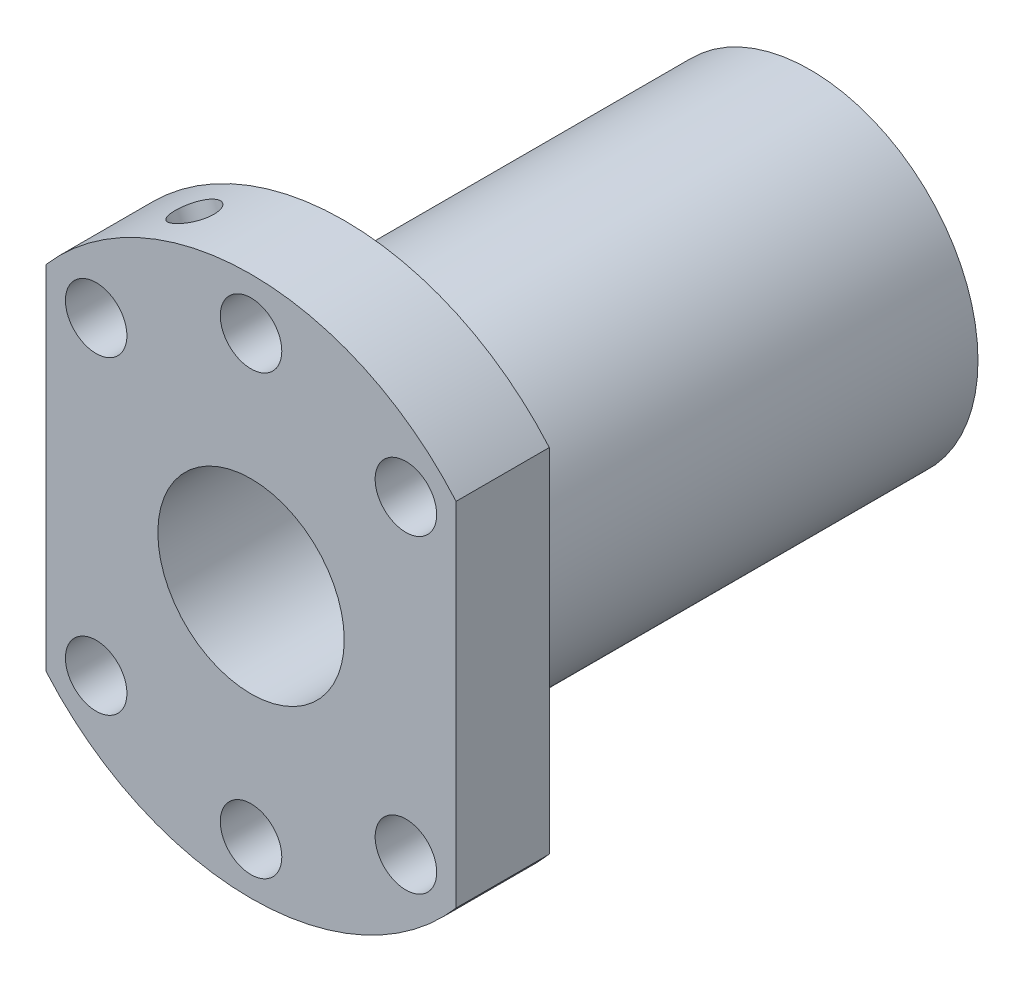
ISO-10303-21;
HEADER;
FILE_DESCRIPTION(('STEP AP214'),'2;1');
FILE_NAME('part.step','',(''),(''),'','','');
FILE_SCHEMA(('AUTOMOTIVE_DESIGN { 1 0 10303 214 1 1 1 1 }'));
ENDSEC;
DATA;
#1=APPLICATION_CONTEXT('core data for automotive mechanical design processes');
#2=APPLICATION_PROTOCOL_DEFINITION('international standard','automotive_design',2000,#1);
#3=PRODUCT_CONTEXT('',#1,'mechanical');
#4=PRODUCT('Part','Part','',(#3));
#5=PRODUCT_RELATED_PRODUCT_CATEGORY('part','',(#4));
#6=PRODUCT_DEFINITION_FORMATION('','',#4);
#7=PRODUCT_DEFINITION_CONTEXT('part definition',#1,'design');
#8=PRODUCT_DEFINITION('design','',#6,#7);
#9=PRODUCT_DEFINITION_SHAPE('','',#8);
#10=(LENGTH_UNIT() NAMED_UNIT(*) SI_UNIT(.MILLI.,.METRE.));
#11=(NAMED_UNIT(*) PLANE_ANGLE_UNIT() SI_UNIT($,.RADIAN.));
#12=(NAMED_UNIT(*) SI_UNIT($,.STERADIAN.) SOLID_ANGLE_UNIT());
#13=UNCERTAINTY_MEASURE_WITH_UNIT(LENGTH_MEASURE(1.E-05),#10,'distance_accuracy_value','');
#14=(GEOMETRIC_REPRESENTATION_CONTEXT(3) GLOBAL_UNCERTAINTY_ASSIGNED_CONTEXT((#13)) GLOBAL_UNIT_ASSIGNED_CONTEXT((#10,
#11,#12)) REPRESENTATION_CONTEXT('',''));
#15=CARTESIAN_POINT('',(0.,0.,0.));
#16=DIRECTION('',(0.,0.,1.));
#17=DIRECTION('',(1.,0.,0.));
#18=AXIS2_PLACEMENT_3D('',#15,#16,#17);
#19=CARTESIAN_POINT('',(0.,0.,10.));
#20=DIRECTION('',(0.,0.,-1.));
#21=DIRECTION('',(-1.,0.,0.));
#22=AXIS2_PLACEMENT_3D('',#19,#20,#21);
#23=CYLINDRICAL_SURFACE('',#22,29.);
#24=DIRECTION('',(0.,0.,-1.));
#25=VECTOR('',#24,1.);
#26=CARTESIAN_POINT('',(22.,-18.8944436276912,10.));
#27=LINE('',#26,#25);
#28=CARTESIAN_POINT('',(22.,-18.8944436276912,10.));
#29=VERTEX_POINT('',#28);
#30=CARTESIAN_POINT('',(22.,-18.8944436276912,0.));
#31=VERTEX_POINT('',#30);
#32=EDGE_CURVE('E35',#29,#31,#27,.T.);
#33=ORIENTED_EDGE('',*,*,#32,.F.);
#34=CARTESIAN_POINT('',(0.,0.,10.));
#35=DIRECTION('',(0.,0.,1.));
#36=DIRECTION('',(1.,0.,0.));
#37=AXIS2_PLACEMENT_3D('',#34,#35,#36);
#38=CIRCLE('',#37,29.);
#39=CARTESIAN_POINT('',(-22.,-18.8944436276912,10.));
#40=VERTEX_POINT('',#39);
#41=EDGE_CURVE('E82',#40,#29,#38,.T.);
#42=ORIENTED_EDGE('',*,*,#41,.F.);
#43=DIRECTION('',(0.,0.,-1.));
#44=VECTOR('',#43,1.);
#45=CARTESIAN_POINT('',(-22.,-18.8944436276912,10.));
#46=LINE('',#45,#44);
#47=CARTESIAN_POINT('',(-22.,-18.8944436276912,0.));
#48=VERTEX_POINT('',#47);
#49=EDGE_CURVE('E62',#48,#40,#46,.F.);
#50=ORIENTED_EDGE('',*,*,#49,.F.);
#51=CARTESIAN_POINT('',(0.,0.,0.));
#52=DIRECTION('',(0.,0.,1.));
#53=DIRECTION('',(1.,0.,0.));
#54=AXIS2_PLACEMENT_3D('',#51,#52,#53);
#55=CIRCLE('',#54,29.);
#56=EDGE_CURVE('E88',#48,#31,#55,.T.);
#57=ORIENTED_EDGE('',*,*,#56,.T.);
#58=EDGE_LOOP('',(#33,#42,#50,#57));
#59=FACE_BOUND('',#58,.T.);
#60=ADVANCED_FACE('F17',(#59),#23,.T.);
#61=CARTESIAN_POINT('',(-13.1430956870748,25.8507066781625,5.));
#62=CARTESIAN_POINT('',(-13.1430910273534,25.8507098656916,4.87382074765021));
#63=CARTESIAN_POINT('',(-13.1335760236543,25.8555535301368,4.74755484804803));
#64=CARTESIAN_POINT('',(-13.0957315229893,25.8747415177147,4.49851449811746));
#65=CARTESIAN_POINT('',(-13.0673805307836,25.889096695138,4.37574420401962));
#66=CARTESIAN_POINT('',(-12.992608813978,25.9267016231538,4.13733818548632));
#67=CARTESIAN_POINT('',(-12.9461981185776,25.94994643689,4.02169854236478));
#68=CARTESIAN_POINT('',(-12.8365220997833,26.0043732887274,3.80077926715828));
#69=CARTESIAN_POINT('',(-12.7732604574558,26.0355535932651,3.69549737930562));
#70=CARTESIAN_POINT('',(-12.6313763581479,26.1046844980456,3.49801766269207));
#71=CARTESIAN_POINT('',(-12.5527236315899,26.14264842662,3.40584624530966));
#72=CARTESIAN_POINT('',(-12.3821912813945,26.2238486711908,3.23743056672695));
#73=CARTESIAN_POINT('',(-12.2903110882349,26.2670852141928,3.161186991663));
#74=CARTESIAN_POINT('',(-12.0956365090408,26.3572965850921,3.02670497332452));
#75=CARTESIAN_POINT('',(-11.9928286289569,26.4042760165459,2.96848914686088));
#76=CARTESIAN_POINT('',(-11.779174882536,26.5002781262989,2.87185984801833));
#77=CARTESIAN_POINT('',(-11.6683291402549,26.5493007730582,2.83344607008957));
#78=CARTESIAN_POINT('',(-11.4418926830045,26.6476695107392,2.77758667519052));
#79=CARTESIAN_POINT('',(-11.3263120604702,26.6970147427143,2.76009863770748));
#80=CARTESIAN_POINT('',(-11.0934453709232,26.7946152260729,2.74645604800824));
#81=CARTESIAN_POINT('',(-10.9761593318603,26.8428704952866,2.75030114656018));
#82=CARTESIAN_POINT('',(-10.7434874733998,26.9368370411531,2.77918090277774));
#83=CARTESIAN_POINT('',(-10.6280981077582,26.9825535692291,2.80416994065078));
#84=CARTESIAN_POINT('',(-10.4022898949398,27.0704091660183,2.87455733582475));
#85=CARTESIAN_POINT('',(-10.2918710896911,27.1125482045572,2.91995586524944));
#86=CARTESIAN_POINT('',(-10.0791086291815,27.1923611991079,3.02992463883377));
#87=CARTESIAN_POINT('',(-9.97677375960755,27.230030318901,3.09451538802822));
#88=CARTESIAN_POINT('',(-9.78332483479341,27.3001310924458,3.24102021316505));
#89=CARTESIAN_POINT('',(-9.6922109763972,27.3325626543209,3.32293459293776));
#90=CARTESIAN_POINT('',(-9.52369608220036,27.391736482991,3.50201871023528));
#91=CARTESIAN_POINT('',(-9.44633181035431,27.4184635341219,3.59922807483385));
#92=CARTESIAN_POINT('',(-9.30795953382609,27.4657469110774,3.80600442489747));
#93=CARTESIAN_POINT('',(-9.24695154016825,27.4863032327429,3.91557141869164));
#94=CARTESIAN_POINT('',(-9.1431664165001,27.5210013871251,4.1439799567316));
#95=CARTESIAN_POINT('',(-9.10039112525439,27.5351425728858,4.26282243497905));
#96=CARTESIAN_POINT('',(-9.03442031691714,27.5568587883038,4.50639564309161));
#97=CARTESIAN_POINT('',(-9.01122444364439,27.564433937408,4.63112626579828));
#98=CARTESIAN_POINT('',(-8.98517976199777,27.5729348395679,4.88258728994691));
#99=CARTESIAN_POINT('',(-8.98227810862838,27.5738778623393,5.00931163576294));
#100=CARTESIAN_POINT('',(-8.996773641772,27.5691515990888,5.2614685025072));
#101=CARTESIAN_POINT('',(-9.01417066451223,27.5634823664157,5.38690103384974));
#102=CARTESIAN_POINT('',(-9.06867977412731,27.5455960148976,5.63275529757644));
#103=CARTESIAN_POINT('',(-9.10576734559255,27.5333870380907,5.75318306047121));
#104=CARTESIAN_POINT('',(-9.19848603673009,27.5025494773878,5.98579588962146));
#105=CARTESIAN_POINT('',(-9.25411741486854,27.483920804013,6.09798084096089));
#106=CARTESIAN_POINT('',(-9.38234692445379,27.4404107520205,6.31117748161546));
#107=CARTESIAN_POINT('',(-9.4549797981084,27.4155165620036,6.41216565933035));
#108=CARTESIAN_POINT('',(-9.6149444147346,27.3598245188869,6.59986467973811));
#109=CARTESIAN_POINT('',(-9.70227637730772,27.3290265775851,6.68657530908889));
#110=CARTESIAN_POINT('',(-9.88922579401284,27.2619346031397,6.8434464456022));
#111=CARTESIAN_POINT('',(-9.98886924941954,27.2256288997433,6.91357098174309));
#112=CARTESIAN_POINT('',(-10.1973290126887,27.1482379825058,7.03503275086956));
#113=CARTESIAN_POINT('',(-10.3061452394268,27.1071528109334,7.08637014998804));
#114=CARTESIAN_POINT('',(-10.5296213108617,27.0211284503978,7.16873834474918));
#115=CARTESIAN_POINT('',(-10.6442745576721,26.9761935753608,7.19979154246248));
#116=CARTESIAN_POINT('',(-10.8761947344602,26.8835260808659,7.24078309500679));
#117=CARTESIAN_POINT('',(-10.9934616221751,26.8357935066265,7.25072179101021));
#118=CARTESIAN_POINT('',(-11.2269272953887,26.7389609627747,7.24919846518744));
#119=CARTESIAN_POINT('',(-11.3431280770366,26.689864912996,7.23779257173386));
#120=CARTESIAN_POINT('',(-11.5715013984623,26.5916492922262,7.19402068394897));
#121=CARTESIAN_POINT('',(-11.6836739322045,26.5425297211999,7.16165465821437));
#122=CARTESIAN_POINT('',(-11.9008899622983,26.4458496265887,7.07689508795456));
#123=CARTESIAN_POINT('',(-12.0059337417276,26.3982890411364,7.02450233922433));
#124=CARTESIAN_POINT('',(-12.2060590887438,26.3063540482966,6.90118326358404));
#125=CARTESIAN_POINT('',(-12.3011408443017,26.261979580796,6.83025728646127));
#126=CARTESIAN_POINT('',(-12.4790506639878,26.1779108554308,6.67167482545593));
#127=CARTESIAN_POINT('',(-12.5618475183488,26.1382285682206,6.58397698268063));
#128=CARTESIAN_POINT('',(-12.7127495234816,26.0651692559111,6.39441118722323));
#129=CARTESIAN_POINT('',(-12.7808511004293,26.0317937648404,6.29253979748475));
#130=CARTESIAN_POINT('',(-12.9006623833682,25.9726278283668,6.0773460574351));
#131=CARTESIAN_POINT('',(-12.9523443973036,25.9468502022112,5.96400478276295));
#132=CARTESIAN_POINT('',(-13.0377657980146,25.9040338029526,5.72930513587154));
#133=CARTESIAN_POINT('',(-13.0715259314503,25.8869849261244,5.60795621727781));
#134=CARTESIAN_POINT('',(-13.111587604492,25.8667075364221,5.40490258953631));
#135=CARTESIAN_POINT('',(-13.1233888270453,25.8607181828407,5.32450594023254));
#136=CARTESIAN_POINT('',(-13.1391443623339,25.8527167301475,5.16275154405354));
#137=CARTESIAN_POINT('',(-13.1430986928972,25.8507046219996,5.08139379936234));
#138=CARTESIAN_POINT('',(-13.1430956870748,25.8507066781625,5.));
#139=B_SPLINE_CURVE_WITH_KNOTS('',3,(#61,#62,#63,#64,#65,#66,#67,#68,#69,#70,#71,#72,#73,#74,
#75,#76,#77,#78,#79,#80,#81,#82,#83,#84,#85,#86,#87,#88,#89,#90,#91,#92,#93,#94,#95,#96,#97,#98,
#99,#100,#101,#102,#103,#104,#105,#106,#107,#108,#109,#110,#111,#112,#113,#114,#115,#116,#117,
#118,#119,#120,#121,#122,#123,#124,#125,#126,#127,#128,#129,#130,#131,#132,#133,#134,#135,#136,
#137,#138),.UNSPECIFIED.,.T.,.F.,(4,2,2,2,2,2,2,2,2,2,2,2,2,2,2,2,2,2,2,2,2,2,2,2,2,2,2,2,2,2,2,
2,2,2,2,2,2,2,4),(0.,0.378240587389282,0.756913558209719,1.13537653780113,1.51375691037454,
1.892889059801,2.2720375380385,2.65165976987221,3.0312761438782,3.41012165140024,
3.78896095708981,4.16698496389398,4.545012158829,4.92344470054419,5.30188387994573,
5.68132019440424,6.06075676460669,6.44023159186731,6.81969951571991,7.1981789575395,
7.57665534575138,7.95466161909181,8.33267316135665,8.71146401206765,9.09026052234297,
9.46987116395547,9.84947844862534,10.2286657792634,10.607846982869,10.986032481081,
11.3642185459065,11.742389584445,12.1205534860801,12.4996622412425,12.8788630902646,
13.2587001183903,13.638096476829,13.8820867355625,14.1260764399499),.UNSPECIFIED.);
#140=CARTESIAN_POINT('',(-13.1430956870748,25.8507066781625,5.));
#141=VERTEX_POINT('',#140);
#142=EDGE_CURVE('E11',#141,#141,#139,.T.);
#143=ORIENTED_EDGE('',*,*,#142,.T.);
#144=EDGE_LOOP('',(#143));
#145=FACE_BOUND('',#144,.T.);
#146=DIRECTION('',(0.,0.,-1.));
#147=VECTOR('',#146,1.);
#148=CARTESIAN_POINT('',(22.,18.8944436276912,10.));
#149=LINE('',#148,#147);
#150=CARTESIAN_POINT('',(22.,18.8944436276912,0.));
#151=VERTEX_POINT('',#150);
#152=CARTESIAN_POINT('',(22.,18.8944436276912,10.));
#153=VERTEX_POINT('',#152);
#154=EDGE_CURVE('E77',#151,#153,#149,.F.);
#155=ORIENTED_EDGE('',*,*,#154,.F.);
#156=CARTESIAN_POINT('',(-22.,18.8944436276912,0.));
#157=VERTEX_POINT('',#156);
#158=EDGE_CURVE('E76',#151,#157,#55,.T.);
#159=ORIENTED_EDGE('',*,*,#158,.T.);
#160=DIRECTION('',(0.,0.,-1.));
#161=VECTOR('',#160,1.);
#162=CARTESIAN_POINT('',(-22.,18.8944436276912,10.));
#163=LINE('',#162,#161);
#164=CARTESIAN_POINT('',(-22.,18.8944436276912,10.));
#165=VERTEX_POINT('',#164);
#166=EDGE_CURVE('E43',#165,#157,#163,.T.);
#167=ORIENTED_EDGE('',*,*,#166,.F.);
#168=EDGE_CURVE('E74',#153,#165,#38,.T.);
#169=ORIENTED_EDGE('',*,*,#168,.F.);
#170=EDGE_LOOP('',(#155,#159,#167,#169));
#171=FACE_BOUND('',#170,.T.);
#172=ADVANCED_FACE('F73',(#145,#171),#23,.T.);
#173=CARTESIAN_POINT('',(0.,0.,10.));
#174=DIRECTION('',(0.,0.,1.));
#175=DIRECTION('',(1.,0.,0.));
#176=AXIS2_PLACEMENT_3D('',#173,#174,#175);
#177=PLANE('',#176);
#178=CARTESIAN_POINT('',(16.6170093578838,-16.617009357884,10.));
#179=DIRECTION('',(0.,0.,1.));
#180=DIRECTION('',(1.,0.,0.));
#181=AXIS2_PLACEMENT_3D('',#178,#179,#180);
#182=CIRCLE('',#181,3.3);
#183=CARTESIAN_POINT('',(19.9170093578838,-16.617009357884,10.));
#184=VERTEX_POINT('',#183);
#185=EDGE_CURVE('E117',#184,#184,#182,.T.);
#186=ORIENTED_EDGE('',*,*,#185,.F.);
#187=EDGE_LOOP('',(#186));
#188=FACE_BOUND('',#187,.T.);
#189=CARTESIAN_POINT('',(-16.6170093578837,-16.617009357884,10.));
#190=DIRECTION('',(0.,0.,1.));
#191=DIRECTION('',(1.,0.,0.));
#192=AXIS2_PLACEMENT_3D('',#189,#190,#191);
#193=CIRCLE('',#192,3.3);
#194=CARTESIAN_POINT('',(-13.3170093578837,-16.617009357884,10.));
#195=VERTEX_POINT('',#194);
#196=EDGE_CURVE('E114',#195,#195,#193,.T.);
#197=ORIENTED_EDGE('',*,*,#196,.F.);
#198=EDGE_LOOP('',(#197));
#199=FACE_BOUND('',#198,.T.);
#200=CARTESIAN_POINT('',(-16.6170093578838,16.617009357884,10.));
#201=DIRECTION('',(0.,0.,1.));
#202=DIRECTION('',(1.,0.,0.));
#203=AXIS2_PLACEMENT_3D('',#200,#201,#202);
#204=CIRCLE('',#203,3.3);
#205=CARTESIAN_POINT('',(-13.3170093578838,16.617009357884,10.));
#206=VERTEX_POINT('',#205);
#207=EDGE_CURVE('E111',#206,#206,#204,.T.);
#208=ORIENTED_EDGE('',*,*,#207,.F.);
#209=EDGE_LOOP('',(#208));
#210=FACE_BOUND('',#209,.T.);
#211=CARTESIAN_POINT('',(16.6170093578837,16.617009357884,10.));
#212=DIRECTION('',(0.,0.,1.));
#213=DIRECTION('',(1.,0.,0.));
#214=AXIS2_PLACEMENT_3D('',#211,#212,#213);
#215=CIRCLE('',#214,3.3);
#216=CARTESIAN_POINT('',(19.9170093578837,16.617009357884,10.));
#217=VERTEX_POINT('',#216);
#218=EDGE_CURVE('E107',#217,#217,#215,.T.);
#219=ORIENTED_EDGE('',*,*,#218,.F.);
#220=EDGE_LOOP('',(#219));
#221=FACE_BOUND('',#220,.T.);
#222=CARTESIAN_POINT('',(0.,-23.5,10.));
#223=DIRECTION('',(0.,0.,1.));
#224=DIRECTION('',(1.,0.,0.));
#225=AXIS2_PLACEMENT_3D('',#222,#223,#224);
#226=CIRCLE('',#225,3.3);
#227=CARTESIAN_POINT('',(3.30000000000001,-23.5,10.));
#228=VERTEX_POINT('',#227);
#229=EDGE_CURVE('E103',#228,#228,#226,.T.);
#230=ORIENTED_EDGE('',*,*,#229,.F.);
#231=EDGE_LOOP('',(#230));
#232=FACE_BOUND('',#231,.T.);
#233=CARTESIAN_POINT('',(0.,23.5,10.));
#234=DIRECTION('',(0.,0.,1.));
#235=DIRECTION('',(1.,0.,0.));
#236=AXIS2_PLACEMENT_3D('',#233,#234,#235);
#237=CIRCLE('',#236,3.3);
#238=CARTESIAN_POINT('',(3.30000000000001,23.5,10.));
#239=VERTEX_POINT('',#238);
#240=EDGE_CURVE('E99',#239,#239,#237,.T.);
#241=ORIENTED_EDGE('',*,*,#240,.F.);
#242=EDGE_LOOP('',(#241));
#243=FACE_BOUND('',#242,.T.);
#244=CARTESIAN_POINT('',(0.,0.,10.));
#245=DIRECTION('',(0.,0.,1.));
#246=DIRECTION('',(1.,0.,0.));
#247=AXIS2_PLACEMENT_3D('',#244,#245,#246);
#248=CIRCLE('',#247,10.);
#249=CARTESIAN_POINT('',(10.,0.,10.));
#250=VERTEX_POINT('',#249);
#251=EDGE_CURVE('E98',#250,#250,#248,.T.);
#252=ORIENTED_EDGE('',*,*,#251,.F.);
#253=EDGE_LOOP('',(#252));
#254=FACE_BOUND('',#253,.T.);
#255=ORIENTED_EDGE('',*,*,#41,.T.);
#256=DIRECTION('',(0.,1.,0.));
#257=VECTOR('',#256,1.);
#258=CARTESIAN_POINT('',(22.,-30.,10.));
#259=LINE('',#258,#257);
#260=EDGE_CURVE('E67',#29,#153,#259,.T.);
#261=ORIENTED_EDGE('',*,*,#260,.T.);
#262=ORIENTED_EDGE('',*,*,#168,.T.);
#263=DIRECTION('',(0.,-1.,0.));
#264=VECTOR('',#263,1.);
#265=CARTESIAN_POINT('',(-22.,-30.,10.));
#266=LINE('',#265,#264);
#267=EDGE_CURVE('E59',#165,#40,#266,.T.);
#268=ORIENTED_EDGE('',*,*,#267,.T.);
#269=EDGE_LOOP('',(#255,#261,#262,#268));
#270=FACE_BOUND('',#269,.T.);
#271=ADVANCED_FACE('F80',(#188,#199,#210,#221,#232,#243,#254,#270),#177,.T.);
#272=CARTESIAN_POINT('',(0.,0.,0.));
#273=DIRECTION('',(0.,0.,1.));
#274=DIRECTION('',(1.,0.,0.));
#275=AXIS2_PLACEMENT_3D('',#272,#273,#274);
#276=PLANE('',#275);
#277=CARTESIAN_POINT('',(16.6170093578838,-16.617009357884,0.));
#278=DIRECTION('',(0.,0.,1.));
#279=DIRECTION('',(1.,0.,0.));
#280=AXIS2_PLACEMENT_3D('',#277,#278,#279);
#281=CIRCLE('',#280,3.3);
#282=CARTESIAN_POINT('',(19.9170093578838,-16.617009357884,0.));
#283=VERTEX_POINT('',#282);
#284=EDGE_CURVE('E115',#283,#283,#281,.T.);
#285=ORIENTED_EDGE('',*,*,#284,.T.);
#286=EDGE_LOOP('',(#285));
#287=FACE_BOUND('',#286,.T.);
#288=CARTESIAN_POINT('',(-16.6170093578837,-16.617009357884,0.));
#289=DIRECTION('',(0.,0.,1.));
#290=DIRECTION('',(1.,0.,0.));
#291=AXIS2_PLACEMENT_3D('',#288,#289,#290);
#292=CIRCLE('',#291,3.3);
#293=CARTESIAN_POINT('',(-13.3170093578837,-16.617009357884,0.));
#294=VERTEX_POINT('',#293);
#295=EDGE_CURVE('E112',#294,#294,#292,.T.);
#296=ORIENTED_EDGE('',*,*,#295,.T.);
#297=EDGE_LOOP('',(#296));
#298=FACE_BOUND('',#297,.T.);
#299=CARTESIAN_POINT('',(-16.6170093578838,16.617009357884,0.));
#300=DIRECTION('',(0.,0.,1.));
#301=DIRECTION('',(1.,0.,0.));
#302=AXIS2_PLACEMENT_3D('',#299,#300,#301);
#303=CIRCLE('',#302,3.3);
#304=CARTESIAN_POINT('',(-13.3170093578838,16.617009357884,0.));
#305=VERTEX_POINT('',#304);
#306=EDGE_CURVE('E108',#305,#305,#303,.T.);
#307=ORIENTED_EDGE('',*,*,#306,.T.);
#308=EDGE_LOOP('',(#307));
#309=FACE_BOUND('',#308,.T.);
#310=CARTESIAN_POINT('',(16.6170093578837,16.617009357884,0.));
#311=DIRECTION('',(0.,0.,1.));
#312=DIRECTION('',(1.,0.,0.));
#313=AXIS2_PLACEMENT_3D('',#310,#311,#312);
#314=CIRCLE('',#313,3.3);
#315=CARTESIAN_POINT('',(19.9170093578837,16.617009357884,0.));
#316=VERTEX_POINT('',#315);
#317=EDGE_CURVE('E104',#316,#316,#314,.T.);
#318=ORIENTED_EDGE('',*,*,#317,.T.);
#319=EDGE_LOOP('',(#318));
#320=FACE_BOUND('',#319,.T.);
#321=CARTESIAN_POINT('',(0.,-23.5,0.));
#322=DIRECTION('',(0.,0.,1.));
#323=DIRECTION('',(1.,0.,0.));
#324=AXIS2_PLACEMENT_3D('',#321,#322,#323);
#325=CIRCLE('',#324,3.3);
#326=CARTESIAN_POINT('',(3.30000000000001,-23.5,0.));
#327=VERTEX_POINT('',#326);
#328=EDGE_CURVE('E100',#327,#327,#325,.T.);
#329=ORIENTED_EDGE('',*,*,#328,.T.);
#330=EDGE_LOOP('',(#329));
#331=FACE_BOUND('',#330,.T.);
#332=CARTESIAN_POINT('',(0.,23.5,0.));
#333=DIRECTION('',(0.,0.,1.));
#334=DIRECTION('',(1.,0.,0.));
#335=AXIS2_PLACEMENT_3D('',#332,#333,#334);
#336=CIRCLE('',#335,3.3);
#337=CARTESIAN_POINT('',(3.30000000000001,23.5,0.));
#338=VERTEX_POINT('',#337);
#339=EDGE_CURVE('E95',#338,#338,#336,.T.);
#340=ORIENTED_EDGE('',*,*,#339,.T.);
#341=EDGE_LOOP('',(#340));
#342=FACE_BOUND('',#341,.T.);
#343=CARTESIAN_POINT('',(0.,0.,0.));
#344=DIRECTION('',(0.,0.,1.));
#345=DIRECTION('',(1.,0.,0.));
#346=AXIS2_PLACEMENT_3D('',#343,#344,#345);
#347=CIRCLE('',#346,18.);
#348=CARTESIAN_POINT('',(18.,0.,0.));
#349=VERTEX_POINT('',#348);
#350=EDGE_CURVE('E91',#349,#349,#347,.T.);
#351=ORIENTED_EDGE('',*,*,#350,.T.);
#352=EDGE_LOOP('',(#351));
#353=FACE_BOUND('',#352,.T.);
#354=DIRECTION('',(0.,1.,0.));
#355=VECTOR('',#354,1.);
#356=CARTESIAN_POINT('',(22.,0.,0.));
#357=LINE('',#356,#355);
#358=EDGE_CURVE('E28',#31,#151,#357,.T.);
#359=ORIENTED_EDGE('',*,*,#358,.F.);
#360=ORIENTED_EDGE('',*,*,#56,.F.);
#361=DIRECTION('',(0.,-1.,0.));
#362=VECTOR('',#361,1.);
#363=CARTESIAN_POINT('',(-22.,0.,0.));
#364=LINE('',#363,#362);
#365=EDGE_CURVE('E81',#157,#48,#364,.T.);
#366=ORIENTED_EDGE('',*,*,#365,.F.);
#367=ORIENTED_EDGE('',*,*,#158,.F.);
#368=EDGE_LOOP('',(#359,#360,#366,#367));
#369=FACE_BOUND('',#368,.T.);
#370=ADVANCED_FACE('F153',(#287,#298,#309,#320,#331,#342,#353,#369),#276,.F.);
#371=CARTESIAN_POINT('',(-22.,-30.,0.));
#372=DIRECTION('',(-1.,0.,0.));
#373=DIRECTION('',(0.,0.,1.));
#374=AXIS2_PLACEMENT_3D('',#371,#372,#373);
#375=PLANE('',#374);
#376=ORIENTED_EDGE('',*,*,#166,.T.);
#377=ORIENTED_EDGE('',*,*,#365,.T.);
#378=ORIENTED_EDGE('',*,*,#49,.T.);
#379=ORIENTED_EDGE('',*,*,#267,.F.);
#380=EDGE_LOOP('',(#376,#377,#378,#379));
#381=FACE_BOUND('',#380,.T.);
#382=ADVANCED_FACE('F60',(#381),#375,.T.);
#383=CARTESIAN_POINT('',(22.,-30.,0.));
#384=DIRECTION('',(1.,0.,0.));
#385=DIRECTION('',(0.,0.,-1.));
#386=AXIS2_PLACEMENT_3D('',#383,#384,#385);
#387=PLANE('',#386);
#388=ORIENTED_EDGE('',*,*,#32,.T.);
#389=ORIENTED_EDGE('',*,*,#358,.T.);
#390=ORIENTED_EDGE('',*,*,#154,.T.);
#391=ORIENTED_EDGE('',*,*,#260,.F.);
#392=EDGE_LOOP('',(#388,#389,#390,#391));
#393=FACE_BOUND('',#392,.T.);
#394=ADVANCED_FACE('F154',(#393),#387,.T.);
#395=CARTESIAN_POINT('',(0.,0.,-50.));
#396=DIRECTION('',(0.,0.,1.));
#397=DIRECTION('',(1.,0.,0.));
#398=AXIS2_PLACEMENT_3D('',#395,#396,#397);
#399=CYLINDRICAL_SURFACE('',#398,18.);
#400=CARTESIAN_POINT('',(0.,0.,-50.));
#401=DIRECTION('',(0.,0.,1.));
#402=DIRECTION('',(1.,0.,0.));
#403=AXIS2_PLACEMENT_3D('',#400,#401,#402);
#404=CIRCLE('',#403,18.);
#405=CARTESIAN_POINT('',(18.,0.,-50.));
#406=VERTEX_POINT('',#405);
#407=EDGE_CURVE('E94',#406,#406,#404,.T.);
#408=ORIENTED_EDGE('',*,*,#407,.T.);
#409=EDGE_LOOP('',(#408));
#410=FACE_BOUND('',#409,.T.);
#411=ORIENTED_EDGE('',*,*,#350,.F.);
#412=EDGE_LOOP('',(#411));
#413=FACE_BOUND('',#412,.T.);
#414=ADVANCED_FACE('F156',(#410,#413),#399,.T.);
#415=CARTESIAN_POINT('',(0.,0.,-50.));
#416=DIRECTION('',(0.,0.,1.));
#417=DIRECTION('',(1.,0.,0.));
#418=AXIS2_PLACEMENT_3D('',#415,#416,#417);
#419=PLANE('',#418);
#420=CARTESIAN_POINT('',(0.,0.,-50.));
#421=DIRECTION('',(0.,0.,1.));
#422=DIRECTION('',(1.,0.,0.));
#423=AXIS2_PLACEMENT_3D('',#420,#421,#422);
#424=CIRCLE('',#423,10.);
#425=CARTESIAN_POINT('',(10.,0.,-50.));
#426=VERTEX_POINT('',#425);
#427=EDGE_CURVE('E141',#426,#426,#424,.T.);
#428=ORIENTED_EDGE('',*,*,#427,.T.);
#429=EDGE_LOOP('',(#428));
#430=FACE_BOUND('',#429,.T.);
#431=ORIENTED_EDGE('',*,*,#407,.F.);
#432=EDGE_LOOP('',(#431));
#433=FACE_BOUND('',#432,.T.);
#434=ADVANCED_FACE('F163',(#430,#433),#419,.F.);
#435=CARTESIAN_POINT('',(0.,0.,-50.));
#436=DIRECTION('',(0.,0.,1.));
#437=DIRECTION('',(1.,0.,0.));
#438=AXIS2_PLACEMENT_3D('',#435,#436,#437);
#439=CYLINDRICAL_SURFACE('',#438,10.);
#440=CARTESIAN_POINT('',(-5.80743849051734,8.14086347870161,5.));
#441=CARTESIAN_POINT('',(-5.80743560905004,8.14086739418837,5.12465493713428));
#442=CARTESIAN_POINT('',(-5.7987606604903,8.14707543253317,5.24935907958387));
#443=CARTESIAN_POINT('',(-5.76425295451306,8.17152487866172,5.49521440615901));
#444=CARTESIAN_POINT('',(-5.7384082577873,8.18977465983846,5.6163630566527));
#445=CARTESIAN_POINT('',(-5.67019227204391,8.23714939732788,5.85151554864559));
#446=CARTESIAN_POINT('',(-5.62783972088312,8.26626202177059,5.96552732143234));
#447=CARTESIAN_POINT('',(-5.52752255682043,8.33367449785792,6.18350349700749));
#448=CARTESIAN_POINT('',(-5.46955807425165,8.37197427280513,6.28746798366381));
#449=CARTESIAN_POINT('',(-5.3381370380877,8.456386532191,6.48425674436179));
#450=CARTESIAN_POINT('',(-5.2644466663179,8.50261459387074,6.57687532789458));
#451=CARTESIAN_POINT('',(-5.10365863225777,8.60008672844758,6.74653970570839));
#452=CARTESIAN_POINT('',(-5.01655989069579,8.65133120500686,6.82358424524172));
#453=CARTESIAN_POINT('',(-4.82976842110331,8.7569949577202,6.96073251599314));
#454=CARTESIAN_POINT('',(-4.72994599397112,8.81144328197798,7.02063759577535));
#455=CARTESIAN_POINT('',(-4.52087032216145,8.92051649390289,7.12052004223791));
#456=CARTESIAN_POINT('',(-4.41161820031385,8.97514135980499,7.16049977767543));
#457=CARTESIAN_POINT('',(-4.18843536257342,9.08141100093222,7.21874744169933));
#458=CARTESIAN_POINT('',(-4.07461199457575,9.13309013374409,7.23736373228074));
#459=CARTESIAN_POINT('',(-3.84383507354,9.23258970751219,7.25344606136174));
#460=CARTESIAN_POINT('',(-3.72688190026013,9.28041061380877,7.25091465434497));
#461=CARTESIAN_POINT('',(-3.49542624211801,9.37001216357405,7.22503120587373));
#462=CARTESIAN_POINT('',(-3.38091753724772,9.41188603670862,7.20205475073033));
#463=CARTESIAN_POINT('',(-3.1555828134363,9.48981132538461,7.13653291848458));
#464=CARTESIAN_POINT('',(-3.04475696748241,9.52586246773321,7.09398662355817));
#465=CARTESIAN_POINT('',(-2.8292215378874,9.59209708497764,6.99020610273303));
#466=CARTESIAN_POINT('',(-2.72456532502479,9.62223348389331,6.92883118346862));
#467=CARTESIAN_POINT('',(-2.52539410964756,9.67641740009756,6.78924085447853));
#468=CARTESIAN_POINT('',(-2.43088056619794,9.70046404202415,6.71102302668353));
#469=CARTESIAN_POINT('',(-2.25290844548311,9.74335567233142,6.53792819802949));
#470=CARTESIAN_POINT('',(-2.16973884666602,9.76207457562237,6.44272253138737));
#471=CARTESIAN_POINT('',(-2.01971162475559,9.79421609401317,6.23942444705811));
#472=CARTESIAN_POINT('',(-1.95285449749796,9.80763854812921,6.13133163780055));
#473=CARTESIAN_POINT('',(-1.8376316657571,9.82988203860265,5.90479750349277));
#474=CARTESIAN_POINT('',(-1.78932744549056,9.83868780989427,5.78632334064247));
#475=CARTESIAN_POINT('',(-1.71341042953301,9.85219402451395,5.54270210761963));
#476=CARTESIAN_POINT('',(-1.68579413911392,9.85689516124351,5.4175561683109));
#477=CARTESIAN_POINT('',(-1.65275137080957,9.86248905554934,5.1670324600476));
#478=CARTESIAN_POINT('',(-1.64685969265277,9.86346167212553,5.04171776088431));
#479=CARTESIAN_POINT('',(-1.65621567520805,9.86189493238001,4.79190941022348));
#480=CARTESIAN_POINT('',(-1.67146179202156,9.85935583255311,4.66741569942847));
#481=CARTESIAN_POINT('',(-1.7221404837595,9.85062803386997,4.42440617680097));
#482=CARTESIAN_POINT('',(-1.75731497878519,9.84448595956964,4.30583462766777));
#483=CARTESIAN_POINT('',(-1.84632386625819,9.82818002883172,4.07621356705517));
#484=CARTESIAN_POINT('',(-1.90016012935584,9.81801576919695,3.96516481099293));
#485=CARTESIAN_POINT('',(-2.02561765927231,9.79290642533533,3.75175733994271));
#486=CARTESIAN_POINT('',(-2.0975131523993,9.77788649319907,3.64956872963782));
#487=CARTESIAN_POINT('',(-2.25623412804361,9.74248452322377,3.45858380141395));
#488=CARTESIAN_POINT('',(-2.34306157795976,9.72210177860564,3.36978925116187));
#489=CARTESIAN_POINT('',(-2.53077948683268,9.67495150693532,3.20631137916771));
#490=CARTESIAN_POINT('',(-2.63191467693992,9.64806538224066,3.13194280754716));
#491=CARTESIAN_POINT('',(-2.84370307366585,9.58777643076646,3.00168537673412));
#492=CARTESIAN_POINT('',(-2.9543558223497,9.55437391742329,2.94579562906397));
#493=CARTESIAN_POINT('',(-3.18096184769501,9.48132617192441,2.85451330207234));
#494=CARTESIAN_POINT('',(-3.29687493953955,9.44172397341232,2.81898676285742));
#495=CARTESIAN_POINT('',(-3.53106719658357,9.35665910045579,2.76902356076605));
#496=CARTESIAN_POINT('',(-3.64934599381761,9.31119733152056,2.75458364350897));
#497=CARTESIAN_POINT('',(-3.88204365830764,9.21657040843438,2.74735700061222));
#498=CARTESIAN_POINT('',(-3.99649023175767,9.16750858484273,2.75410143700231));
#499=CARTESIAN_POINT('',(-4.22093057880654,9.06636086798007,2.78799856896313));
#500=CARTESIAN_POINT('',(-4.33092444163677,9.01427503536057,2.81515085535119));
#501=CARTESIAN_POINT('',(-4.54317660166591,8.90918252054627,2.88886281836227));
#502=CARTESIAN_POINT('',(-4.64546125615977,8.85617981627675,2.93535246058558));
#503=CARTESIAN_POINT('',(-4.84031678190181,8.75120542457214,3.04635249398108));
#504=CARTESIAN_POINT('',(-4.93288665081098,8.69923384397265,3.1108647421556));
#505=CARTESIAN_POINT('',(-5.10805453001669,8.59757235607552,3.25758865719416));
#506=CARTESIAN_POINT('',(-5.19041662970488,8.54794869409196,3.34012789418093));
#507=CARTESIAN_POINT('',(-5.34126761045818,8.45451074784953,3.51990667828516));
#508=CARTESIAN_POINT('',(-5.40975311576655,8.41069787807439,3.61714979238929));
#509=CARTESIAN_POINT('',(-5.53230785262249,8.330607425835,3.82525285714924));
#510=CARTESIAN_POINT('',(-5.58615638270926,8.29444684931997,3.93628800323913));
#511=CARTESIAN_POINT('',(-5.67690868920494,8.23260264975623,4.16773561528555));
#512=CARTESIAN_POINT('',(-5.71382643377734,8.20691039213971,4.28814025497725));
#513=CARTESIAN_POINT('',(-5.76361918412281,8.17198789175651,4.50717446375175));
#514=CARTESIAN_POINT('',(-5.78002744190599,8.16035925062714,4.60463995420252));
#515=CARTESIAN_POINT('',(-5.80193794519519,8.14479569436048,4.80139328426913));
#516=CARTESIAN_POINT('',(-5.80744078632999,8.14086035903267,4.90068102405894));
#517=CARTESIAN_POINT('',(-5.80743849051734,8.14086347870161,5.));
#518=B_SPLINE_CURVE_WITH_KNOTS('',3,(#440,#441,#442,#443,#444,#445,#446,#447,#448,#449,#450,
#451,#452,#453,#454,#455,#456,#457,#458,#459,#460,#461,#462,#463,#464,#465,#466,#467,#468,#469,
#470,#471,#472,#473,#474,#475,#476,#477,#478,#479,#480,#481,#482,#483,#484,#485,#486,#487,#488,
#489,#490,#491,#492,#493,#494,#495,#496,#497,#498,#499,#500,#501,#502,#503,#504,#505,#506,#507,
#508,#509,#510,#511,#512,#513,#514,#515,#516,#517),.UNSPECIFIED.,.T.,.F.,(4,2,2,2,2,2,2,2,2,2,2,
2,2,2,2,2,2,2,2,2,2,2,2,2,2,2,2,2,2,2,2,2,2,2,2,2,2,2,4),(0.,0.37360068321205,0.747461429010006,
1.12089904026706,1.49433353405061,1.87376445216186,2.25322592755653,2.63692212096272,
3.02057268905775,3.3978741763011,3.77513008900696,4.14559549062182,4.51607826880895,
4.88939977173562,5.26277490672005,5.64436489931666,6.02596648932098,6.40882201190648,
6.7916128456685,7.1661575467213,7.54067489257641,7.91044946967034,8.28026112358675,
8.65606921440563,9.03192685878778,9.41523792815892,9.79853056492471,10.1792718741986,
10.5599544159687,10.9322717825488,11.3045816842686,11.6755547669031,12.0465660877438,
12.4249825862442,12.8034910318269,13.1874247243883,13.5710410932789,13.8687241607271,
14.1663909689621),.UNSPECIFIED.);
#519=CARTESIAN_POINT('',(-5.80743849051734,8.14086347870161,5.));
#520=VERTEX_POINT('',#519);
#521=EDGE_CURVE('E123',#520,#520,#518,.T.);
#522=ORIENTED_EDGE('',*,*,#521,.T.);
#523=EDGE_LOOP('',(#522));
#524=FACE_BOUND('',#523,.T.);
#525=ORIENTED_EDGE('',*,*,#427,.F.);
#526=EDGE_LOOP('',(#525));
#527=FACE_BOUND('',#526,.T.);
#528=ORIENTED_EDGE('',*,*,#251,.T.);
#529=EDGE_LOOP('',(#528));
#530=FACE_BOUND('',#529,.T.);
#531=ADVANCED_FACE('F185',(#524,#527,#530),#439,.F.);
#532=CARTESIAN_POINT('',(0.,23.5,-50.));
#533=DIRECTION('',(0.,0.,1.));
#534=DIRECTION('',(1.,0.,0.));
#535=AXIS2_PLACEMENT_3D('',#532,#533,#534);
#536=CYLINDRICAL_SURFACE('',#535,3.3);
#537=ORIENTED_EDGE('',*,*,#240,.T.);
#538=EDGE_LOOP('',(#537));
#539=FACE_BOUND('',#538,.T.);
#540=ORIENTED_EDGE('',*,*,#339,.F.);
#541=EDGE_LOOP('',(#540));
#542=FACE_BOUND('',#541,.T.);
#543=ADVANCED_FACE('F188',(#539,#542),#536,.F.);
#544=CARTESIAN_POINT('',(0.,-23.5,-50.));
#545=DIRECTION('',(0.,0.,1.));
#546=DIRECTION('',(1.,0.,0.));
#547=AXIS2_PLACEMENT_3D('',#544,#545,#546);
#548=CYLINDRICAL_SURFACE('',#547,3.3);
#549=ORIENTED_EDGE('',*,*,#229,.T.);
#550=EDGE_LOOP('',(#549));
#551=FACE_BOUND('',#550,.T.);
#552=ORIENTED_EDGE('',*,*,#328,.F.);
#553=EDGE_LOOP('',(#552));
#554=FACE_BOUND('',#553,.T.);
#555=ADVANCED_FACE('F216',(#551,#554),#548,.F.);
#556=CARTESIAN_POINT('',(16.6170093578837,16.617009357884,-50.));
#557=DIRECTION('',(0.,0.,1.));
#558=DIRECTION('',(1.,0.,0.));
#559=AXIS2_PLACEMENT_3D('',#556,#557,#558);
#560=CYLINDRICAL_SURFACE('',#559,3.3);
#561=ORIENTED_EDGE('',*,*,#218,.T.);
#562=EDGE_LOOP('',(#561));
#563=FACE_BOUND('',#562,.T.);
#564=ORIENTED_EDGE('',*,*,#317,.F.);
#565=EDGE_LOOP('',(#564));
#566=FACE_BOUND('',#565,.T.);
#567=ADVANCED_FACE('F222',(#563,#566),#560,.F.);
#568=CARTESIAN_POINT('',(-16.6170093578838,16.617009357884,-50.));
#569=DIRECTION('',(0.,0.,1.));
#570=DIRECTION('',(1.,0.,0.));
#571=AXIS2_PLACEMENT_3D('',#568,#569,#570);
#572=CYLINDRICAL_SURFACE('',#571,3.3);
#573=ORIENTED_EDGE('',*,*,#207,.T.);
#574=EDGE_LOOP('',(#573));
#575=FACE_BOUND('',#574,.T.);
#576=ORIENTED_EDGE('',*,*,#306,.F.);
#577=EDGE_LOOP('',(#576));
#578=FACE_BOUND('',#577,.T.);
#579=ADVANCED_FACE('F229',(#575,#578),#572,.F.);
#580=CARTESIAN_POINT('',(-16.6170093578837,-16.617009357884,-50.));
#581=DIRECTION('',(0.,0.,1.));
#582=DIRECTION('',(1.,0.,0.));
#583=AXIS2_PLACEMENT_3D('',#580,#581,#582);
#584=CYLINDRICAL_SURFACE('',#583,3.3);
#585=ORIENTED_EDGE('',*,*,#196,.T.);
#586=EDGE_LOOP('',(#585));
#587=FACE_BOUND('',#586,.T.);
#588=ORIENTED_EDGE('',*,*,#295,.F.);
#589=EDGE_LOOP('',(#588));
#590=FACE_BOUND('',#589,.T.);
#591=ADVANCED_FACE('F233',(#587,#590),#584,.F.);
#592=CARTESIAN_POINT('',(16.6170093578838,-16.617009357884,-50.));
#593=DIRECTION('',(0.,0.,1.));
#594=DIRECTION('',(1.,0.,0.));
#595=AXIS2_PLACEMENT_3D('',#592,#593,#594);
#596=CYLINDRICAL_SURFACE('',#595,3.3);
#597=ORIENTED_EDGE('',*,*,#185,.T.);
#598=EDGE_LOOP('',(#597));
#599=FACE_BOUND('',#598,.T.);
#600=ORIENTED_EDGE('',*,*,#284,.F.);
#601=EDGE_LOOP('',(#600));
#602=FACE_BOUND('',#601,.T.);
#603=ADVANCED_FACE('F182',(#599,#602),#596,.F.);
#604=CARTESIAN_POINT('',(-11.0978194815633,26.7925064664475,5.));
#605=DIRECTION('',(-0.382683430398736,0.923879533325777,0.));
#606=DIRECTION('',(-0.923879533325777,-0.382683430398736,0.));
#607=AXIS2_PLACEMENT_3D('',#604,#605,#606);
#608=CYLINDRICAL_SURFACE('',#607,2.25);
#609=ORIENTED_EDGE('',*,*,#142,.F.);
#610=EDGE_LOOP('',(#609));
#611=FACE_BOUND('',#610,.T.);
#612=ORIENTED_EDGE('',*,*,#521,.F.);
#613=EDGE_LOOP('',(#612));
#614=FACE_BOUND('',#613,.T.);
#615=ADVANCED_FACE('F179',(#611,#614),#608,.F.);
#616=CLOSED_SHELL('',(#60,#172,#271,#370,#382,#394,#414,#434,#531,#543,#555,#567,#579,#591,#603,#615));
#617=MANIFOLD_SOLID_BREP('B1',#616);
#618=ADVANCED_BREP_SHAPE_REPRESENTATION('',(#18,#617),#14);
#619=SHAPE_DEFINITION_REPRESENTATION(#9,#618);
ENDSEC;
END-ISO-10303-21;
